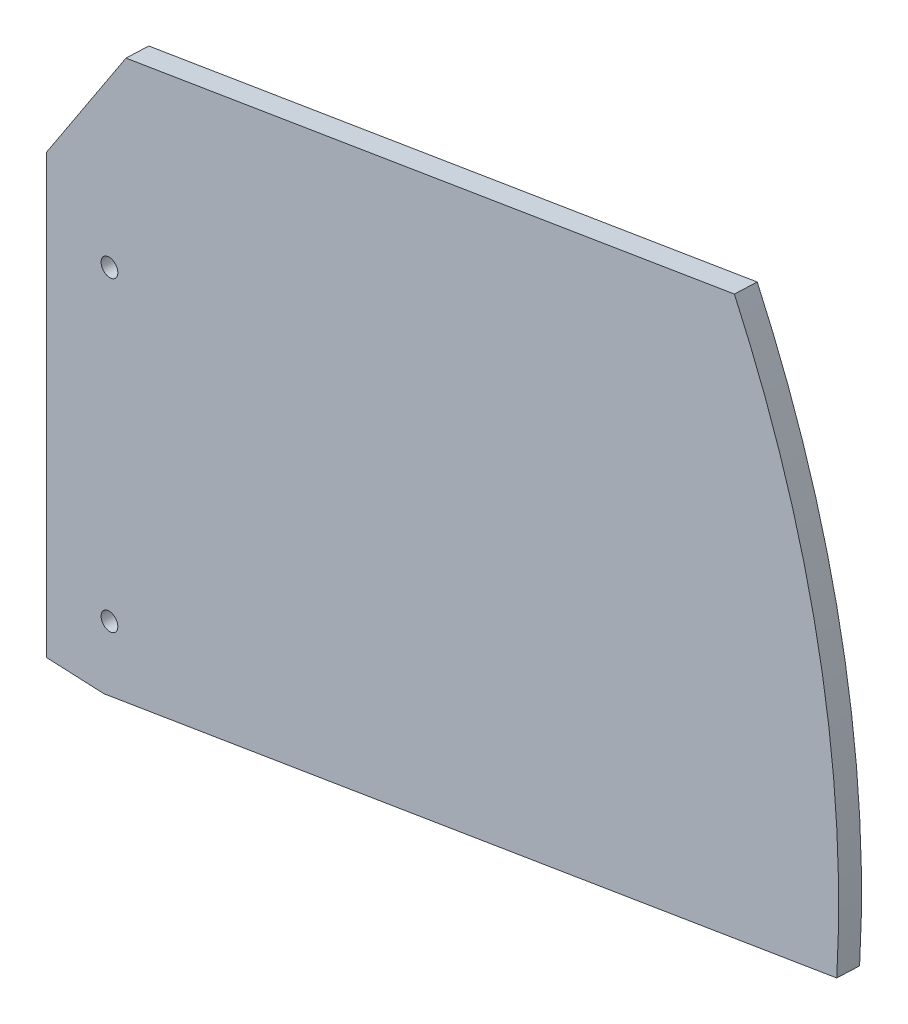
ISO-10303-21;
HEADER;
FILE_DESCRIPTION(('STEP AP214'),'2;1');
FILE_NAME('part.step','',(''),(''),'','','');
FILE_SCHEMA(('AUTOMOTIVE_DESIGN { 1 0 10303 214 1 1 1 1 }'));
ENDSEC;
DATA;
#1=APPLICATION_CONTEXT('core data for automotive mechanical design processes');
#2=APPLICATION_PROTOCOL_DEFINITION('international standard','automotive_design',2000,#1);
#3=PRODUCT_CONTEXT('',#1,'mechanical');
#4=PRODUCT('Part','Part','',(#3));
#5=PRODUCT_RELATED_PRODUCT_CATEGORY('part','',(#4));
#6=PRODUCT_DEFINITION_FORMATION('','',#4);
#7=PRODUCT_DEFINITION_CONTEXT('part definition',#1,'design');
#8=PRODUCT_DEFINITION('design','',#6,#7);
#9=PRODUCT_DEFINITION_SHAPE('','',#8);
#10=(LENGTH_UNIT() NAMED_UNIT(*) SI_UNIT(.MILLI.,.METRE.));
#11=(NAMED_UNIT(*) PLANE_ANGLE_UNIT() SI_UNIT($,.RADIAN.));
#12=(NAMED_UNIT(*) SI_UNIT($,.STERADIAN.) SOLID_ANGLE_UNIT());
#13=UNCERTAINTY_MEASURE_WITH_UNIT(LENGTH_MEASURE(1.E-05),#10,'distance_accuracy_value','');
#14=(GEOMETRIC_REPRESENTATION_CONTEXT(3) GLOBAL_UNCERTAINTY_ASSIGNED_CONTEXT((#13)) GLOBAL_UNIT_ASSIGNED_CONTEXT((#10,
#11,#12)) REPRESENTATION_CONTEXT('',''));
#15=CARTESIAN_POINT('',(0.,0.,0.));
#16=DIRECTION('',(0.,0.,1.));
#17=DIRECTION('',(1.,0.,0.));
#18=AXIS2_PLACEMENT_3D('',#15,#16,#17);
#19=CARTESIAN_POINT('',(29.3919854516671,-17.5,128.608300989372));
#20=DIRECTION('',(0.0436193873653366,0.,-0.999048221581858));
#21=DIRECTION('',(-0.999048221581858,0.,-0.0436193873653366));
#22=AXIS2_PLACEMENT_3D('',#19,#20,#21);
#23=CYLINDRICAL_SURFACE('',#22,1.00000013504685);
#24=CARTESIAN_POINT('',(34.7638598781959,-17.5,5.57214856854477));
#25=DIRECTION('',(0.0436193873653366,0.,-0.999048221581858));
#26=DIRECTION('',(-0.999048221581858,0.,-0.0436193873653366));
#27=AXIS2_PLACEMENT_3D('',#24,#25,#26);
#28=CIRCLE('',#27,1.00000013504685);
#29=CARTESIAN_POINT('',(33.7648115216957,-17.5,5.52852917528877));
#30=VERTEX_POINT('',#29);
#31=EDGE_CURVE('E55',#30,#30,#28,.T.);
#32=ORIENTED_EDGE('',*,*,#31,.F.);
#33=EDGE_LOOP('',(#32));
#34=FACE_BOUND('',#33,.T.);
#35=CARTESIAN_POINT('',(34.8729083466093,-17.5,3.0745280145901));
#36=DIRECTION('',(0.0436193873653365,0.,-0.999048221581858));
#37=DIRECTION('',(-0.999048221581858,0.,-0.0436193873653365));
#38=AXIS2_PLACEMENT_3D('',#35,#36,#37);
#39=CIRCLE('',#38,1.00000013504685);
#40=CARTESIAN_POINT('',(33.8738599901091,-17.5,3.0309086213341));
#41=VERTEX_POINT('',#40);
#42=EDGE_CURVE('E128',#41,#41,#39,.F.);
#43=ORIENTED_EDGE('',*,*,#42,.F.);
#44=EDGE_LOOP('',(#43));
#45=FACE_BOUND('',#44,.T.);
#46=ADVANCED_FACE('F45',(#34,#45),#23,.F.);
#47=CARTESIAN_POINT('',(29.3919854516671,17.5,128.608300989372));
#48=DIRECTION('',(0.0436193873653366,0.,-0.999048221581858));
#49=DIRECTION('',(-0.999048221581858,0.,-0.0436193873653366));
#50=AXIS2_PLACEMENT_3D('',#47,#48,#49);
#51=CYLINDRICAL_SURFACE('',#50,1.00000013504685);
#52=CARTESIAN_POINT('',(34.7638598781959,17.5,5.57214856854477));
#53=DIRECTION('',(0.0436193873653366,0.,-0.999048221581858));
#54=DIRECTION('',(-0.999048221581858,0.,-0.0436193873653366));
#55=AXIS2_PLACEMENT_3D('',#52,#53,#54);
#56=CIRCLE('',#55,1.00000013504685);
#57=CARTESIAN_POINT('',(33.7648115216957,17.5,5.52852917528877));
#58=VERTEX_POINT('',#57);
#59=EDGE_CURVE('E11',#58,#58,#56,.T.);
#60=ORIENTED_EDGE('',*,*,#59,.F.);
#61=EDGE_LOOP('',(#60));
#62=FACE_BOUND('',#61,.T.);
#63=CARTESIAN_POINT('',(34.8729083466093,17.5,3.0745280145901));
#64=DIRECTION('',(0.0436193873653365,0.,-0.999048221581858));
#65=DIRECTION('',(-0.999048221581858,0.,-0.0436193873653365));
#66=AXIS2_PLACEMENT_3D('',#63,#64,#65);
#67=CIRCLE('',#66,1.00000013504685);
#68=CARTESIAN_POINT('',(33.8738599901091,17.5,3.0309086213341));
#69=VERTEX_POINT('',#68);
#70=EDGE_CURVE('E115',#69,#69,#67,.F.);
#71=ORIENTED_EDGE('',*,*,#70,.F.);
#72=EDGE_LOOP('',(#71));
#73=FACE_BOUND('',#72,.T.);
#74=ADVANCED_FACE('F47',(#62,#73),#51,.F.);
#75=CARTESIAN_POINT('',(-5.54855330895833,-25.,127.082764121352));
#76=DIRECTION('',(0.,1.,0.));
#77=DIRECTION('',(0.,0.,1.));
#78=AXIS2_PLACEMENT_3D('',#75,#76,#77);
#79=PLANE('',#78);
#80=DIRECTION('',(0.0436193873653366,0.,-0.999048221581858));
#81=VECTOR('',#80,1.);
#82=CARTESIAN_POINT('',(28.7414972189742,-25.,128.579900059782));
#83=LINE('',#82,#81);
#84=CARTESIAN_POINT('',(34.113371645503,-25.,5.54374763895452));
#85=VERTEX_POINT('',#84);
#86=CARTESIAN_POINT('',(34.2224201139163,-25.,3.04612708499982));
#87=VERTEX_POINT('',#86);
#88=EDGE_CURVE('E119',#85,#87,#83,.T.);
#89=ORIENTED_EDGE('',*,*,#88,.F.);
#90=DIRECTION('',(-0.999048221581858,0.,-0.0436193873653366));
#91=VECTOR('',#90,1.);
#92=CARTESIAN_POINT('',(-0.176678882429508,-25.,4.04661170052444));
#93=LINE('',#92,#91);
#94=CARTESIAN_POINT('',(27.270998216332,-25.,5.24500316330476));
#95=VERTEX_POINT('',#94);
#96=EDGE_CURVE('E49',#85,#95,#93,.T.);
#97=ORIENTED_EDGE('',*,*,#96,.T.);
#98=DIRECTION('',(0.0436193873653366,0.,-0.999048221581858));
#99=VECTOR('',#98,1.);
#100=CARTESIAN_POINT('',(21.8991237898032,-25.,128.281155584132));
#101=LINE('',#100,#99);
#102=CARTESIAN_POINT('',(27.3800466847453,-25.,2.74738260935008));
#103=VERTEX_POINT('',#102);
#104=EDGE_CURVE('E196',#95,#103,#101,.T.);
#105=ORIENTED_EDGE('',*,*,#104,.T.);
#106=DIRECTION('',(0.999048221581858,0.,0.0436193873653365));
#107=VECTOR('',#106,1.);
#108=CARTESIAN_POINT('',(-0.0676304140161659,-25.,1.54899114656976));
#109=LINE('',#108,#107);
#110=EDGE_CURVE('E120',#103,#87,#109,.T.);
#111=ORIENTED_EDGE('',*,*,#110,.T.);
#112=EDGE_LOOP('',(#89,#97,#105,#111));
#113=FACE_BOUND('',#112,.T.);
#114=ADVANCED_FACE('F159',(#113),#79,.F.);
#115=CARTESIAN_POINT('',(21.8991237898032,0.,128.281155584132));
#116=DIRECTION('',(0.999048221581858,0.,0.0436193873653366));
#117=DIRECTION('',(0.0436193873653366,0.,-0.999048221581858));
#118=AXIS2_PLACEMENT_3D('',#115,#116,#117);
#119=PLANE('',#118);
#120=ORIENTED_EDGE('',*,*,#104,.F.);
#121=DIRECTION('',(0.,1.,0.));
#122=VECTOR('',#121,1.);
#123=CARTESIAN_POINT('',(27.270998216332,0.,5.24500316330474));
#124=LINE('',#123,#122);
#125=CARTESIAN_POINT('',(27.270998216332,25.,5.24500316330474));
#126=VERTEX_POINT('',#125);
#127=EDGE_CURVE('E131',#95,#126,#124,.T.);
#128=ORIENTED_EDGE('',*,*,#127,.T.);
#129=DIRECTION('',(0.0436193873653366,0.,-0.999048221581858));
#130=VECTOR('',#129,1.);
#131=CARTESIAN_POINT('',(21.8991237898032,25.,128.281155584132));
#132=LINE('',#131,#130);
#133=CARTESIAN_POINT('',(27.3800466847453,25.,2.74738260935008));
#134=VERTEX_POINT('',#133);
#135=EDGE_CURVE('E191',#126,#134,#132,.T.);
#136=ORIENTED_EDGE('',*,*,#135,.T.);
#137=DIRECTION('',(0.,-1.,0.));
#138=VECTOR('',#137,1.);
#139=CARTESIAN_POINT('',(27.3800466847453,0.,2.74738260935008));
#140=LINE('',#139,#138);
#141=EDGE_CURVE('E122',#134,#103,#140,.T.);
#142=ORIENTED_EDGE('',*,*,#141,.T.);
#143=EDGE_LOOP('',(#120,#128,#136,#142));
#144=FACE_BOUND('',#143,.T.);
#145=ADVANCED_FACE('F175',(#144),#119,.F.);
#146=CARTESIAN_POINT('',(1.93936242115658,-4.99262466653474,127.409693582548));
#147=DIRECTION('',(-0.831466947064897,0.554386900032706,-0.0363026309061158));
#148=DIRECTION('',(-0.554752569488118,-0.832015376448255,0.));
#149=AXIS2_PLACEMENT_3D('',#146,#147,#148);
#150=PLANE('',#149);
#151=DIRECTION('',(-0.553859246545954,-0.832259073289157,-0.0241820169427947));
#152=VECTOR('',#151,1.);
#153=CARTESIAN_POINT('',(7.31123684768539,-4.99262466653474,4.37354116172074));
#154=LINE('',#153,#152);
#155=CARTESIAN_POINT('',(36.7399653153755,39.2285857499025,5.65842719521868));
#156=VERTEX_POINT('',#155);
#157=EDGE_CURVE('E134',#156,#126,#154,.T.);
#158=ORIENTED_EDGE('',*,*,#157,.F.);
#159=DIRECTION('',(0.0436193873653366,0.,-0.999048221581858));
#160=VECTOR('',#159,1.);
#161=CARTESIAN_POINT('',(31.3680908888467,39.2285857499025,128.694579616046));
#162=LINE('',#161,#160);
#163=CARTESIAN_POINT('',(36.8490137837889,39.2285857499025,3.16080664126402));
#164=VERTEX_POINT('',#163);
#165=EDGE_CURVE('E190',#156,#164,#162,.T.);
#166=ORIENTED_EDGE('',*,*,#165,.T.);
#167=DIRECTION('',(0.553859246545954,0.832259073289157,0.0241820169427947));
#168=VECTOR('',#167,1.);
#169=CARTESIAN_POINT('',(7.42028531609874,-4.99262466653473,1.87592060776606));
#170=LINE('',#169,#168);
#171=EDGE_CURVE('E201',#134,#164,#170,.T.);
#172=ORIENTED_EDGE('',*,*,#171,.F.);
#173=ORIENTED_EDGE('',*,*,#135,.F.);
#174=EDGE_LOOP('',(#158,#166,#172,#173));
#175=FACE_BOUND('',#174,.T.);
#176=ADVANCED_FACE('F178',(#175),#150,.T.);
#177=CARTESIAN_POINT('',(-11.6737284184888,30.5951505871221,126.81533320059));
#178=DIRECTION('',(-0.196298287546547,0.98050677084091,-0.0085705683256086));
#179=DIRECTION('',(-0.980542784211567,-0.196305497453913,0.));
#180=AXIS2_PLACEMENT_3D('',#177,#178,#179);
#181=PLANE('',#180);
#182=DIRECTION('',(-0.979573545657581,-0.196485298012678,-0.042769104651645));
#183=VECTOR('',#182,1.);
#184=CARTESIAN_POINT('',(-6.30185399195996,30.5951505871221,3.77918077976257));
#185=LINE('',#184,#183);
#186=CARTESIAN_POINT('',(109.374319684513,53.7977651927773,8.82971159452624));
#187=VERTEX_POINT('',#186);
#188=EDGE_CURVE('E136',#187,#156,#185,.T.);
#189=ORIENTED_EDGE('',*,*,#188,.F.);
#190=DIRECTION('',(0.0436193873653366,0.,-0.999048221581858));
#191=VECTOR('',#190,1.);
#192=CARTESIAN_POINT('',(104.002445257984,53.7977651927773,131.865864015354));
#193=LINE('',#192,#191);
#194=CARTESIAN_POINT('',(109.483368152926,53.7977651927773,6.33209104057156));
#195=VERTEX_POINT('',#194);
#196=EDGE_CURVE('E103',#187,#195,#193,.T.);
#197=ORIENTED_EDGE('',*,*,#196,.T.);
#198=DIRECTION('',(0.979573545657581,0.196485298012678,0.0427691046516449));
#199=VECTOR('',#198,1.);
#200=CARTESIAN_POINT('',(-6.19280552354661,30.5951505871221,1.28156022580793));
#201=LINE('',#200,#199);
#202=EDGE_CURVE('E114',#164,#195,#201,.T.);
#203=ORIENTED_EDGE('',*,*,#202,.F.);
#204=ORIENTED_EDGE('',*,*,#165,.F.);
#205=EDGE_LOOP('',(#189,#197,#203,#204));
#206=FACE_BOUND('',#205,.T.);
#207=ADVANCED_FACE('F150',(#206),#181,.T.);
#208=CARTESIAN_POINT('',(-5.54855330895833,0.,127.082764121352));
#209=DIRECTION('',(-0.0436193873653366,0.,0.999048221581858));
#210=DIRECTION('',(0.,1.,0.));
#211=AXIS2_PLACEMENT_3D('',#208,#209,#210);
#212=ELLIPSE('',#211,122.235103500815,122.118762767364);
#213=DIRECTION('',(0.0436193873653366,0.,-0.999048221581858));
#214=VECTOR('',#213,1.);
#215=SURFACE_OF_LINEAR_EXTRUSION('',#212,#214);
#216=ORIENTED_EDGE('',*,*,#196,.F.);
#217=CARTESIAN_POINT('',(-0.176678882429518,0.,4.04661170052448));
#218=DIRECTION('',(-0.0436193873653366,0.,0.999048221581858));
#219=DIRECTION('',(0.,1.,0.));
#220=AXIS2_PLACEMENT_3D('',#217,#218,#219);
#221=ELLIPSE('',#220,122.235103500815,122.118762767364);
#222=CARTESIAN_POINT('',(121.598925621703,-7.45193000462398,9.36344941642904));
#223=VERTEX_POINT('',#222);
#224=EDGE_CURVE('E63',#187,#223,#221,.F.);
#225=ORIENTED_EDGE('',*,*,#224,.T.);
#226=DIRECTION('',(0.0436193873653366,0.,-0.999048221581858));
#227=VECTOR('',#226,1.);
#228=CARTESIAN_POINT('',(116.227051195174,-7.45193000462398,132.399601837257));
#229=LINE('',#228,#227);
#230=CARTESIAN_POINT('',(121.707974090116,-7.45193000462398,6.86582886247429));
#231=VERTEX_POINT('',#230);
#232=EDGE_CURVE('E96',#223,#231,#229,.T.);
#233=ORIENTED_EDGE('',*,*,#232,.T.);
#234=CARTESIAN_POINT('',(-0.0676304140161737,0.,1.54899114656976));
#235=DIRECTION('',(-0.0436193873653366,0.,0.999048221581858));
#236=DIRECTION('',(0.,1.,0.));
#237=AXIS2_PLACEMENT_3D('',#234,#235,#236);
#238=ELLIPSE('',#237,122.235103500815,122.118762767364);
#239=EDGE_CURVE('E99',#231,#195,#238,.T.);
#240=ORIENTED_EDGE('',*,*,#239,.T.);
#241=EDGE_LOOP('',(#216,#225,#233,#240));
#242=FACE_BOUND('',#241,.T.);
#243=ADVANCED_FACE('F98',(#242),#215,.F.);
#244=CARTESIAN_POINT('',(0.587059579215182,-30.6472871225956,127.350650765371));
#245=DIRECTION('',(-0.196298287546547,0.98050677084091,-0.0085705683256086));
#246=DIRECTION('',(-0.980542784211567,-0.196305497453913,0.));
#247=AXIS2_PLACEMENT_3D('',#244,#245,#246);
#248=PLANE('',#247);
#249=ORIENTED_EDGE('',*,*,#232,.F.);
#250=DIRECTION('',(-0.979573545657581,-0.196485298012678,-0.042769104651645));
#251=VECTOR('',#250,1.);
#252=CARTESIAN_POINT('',(5.958934005744,-30.6472871225956,4.3144983445437));
#253=LINE('',#252,#251);
#254=EDGE_CURVE('E139',#223,#85,#253,.T.);
#255=ORIENTED_EDGE('',*,*,#254,.T.);
#256=ORIENTED_EDGE('',*,*,#88,.T.);
#257=DIRECTION('',(0.979573545657581,0.196485298012678,0.0427691046516449));
#258=VECTOR('',#257,1.);
#259=CARTESIAN_POINT('',(6.06798247415735,-30.6472871225956,1.81687779058905));
#260=LINE('',#259,#258);
#261=EDGE_CURVE('E110',#87,#231,#260,.T.);
#262=ORIENTED_EDGE('',*,*,#261,.T.);
#263=EDGE_LOOP('',(#249,#255,#256,#262));
#264=FACE_BOUND('',#263,.T.);
#265=ADVANCED_FACE('F117',(#264),#248,.F.);
#266=CARTESIAN_POINT('',(-0.176678882429516,-27.5,4.04661170052443));
#267=DIRECTION('',(0.0436193873653366,0.,-0.999048221581858));
#268=DIRECTION('',(-0.999048221581858,0.,-0.0436193873653366));
#269=AXIS2_PLACEMENT_3D('',#266,#267,#268);
#270=PLANE('',#269);
#271=ORIENTED_EDGE('',*,*,#31,.T.);
#272=EDGE_LOOP('',(#271));
#273=FACE_BOUND('',#272,.T.);
#274=ORIENTED_EDGE('',*,*,#59,.T.);
#275=EDGE_LOOP('',(#274));
#276=FACE_BOUND('',#275,.T.);
#277=ORIENTED_EDGE('',*,*,#224,.F.);
#278=ORIENTED_EDGE('',*,*,#188,.T.);
#279=ORIENTED_EDGE('',*,*,#157,.T.);
#280=ORIENTED_EDGE('',*,*,#127,.F.);
#281=ORIENTED_EDGE('',*,*,#96,.F.);
#282=ORIENTED_EDGE('',*,*,#254,.F.);
#283=EDGE_LOOP('',(#277,#278,#279,#280,#281,#282));
#284=FACE_BOUND('',#283,.T.);
#285=ADVANCED_FACE('F153',(#273,#276,#284),#270,.F.);
#286=CARTESIAN_POINT('',(-0.067630414016175,-27.5,1.54899114656979));
#287=DIRECTION('',(0.0436193873653365,0.,-0.999048221581858));
#288=DIRECTION('',(-0.999048221581858,0.,-0.0436193873653365));
#289=AXIS2_PLACEMENT_3D('',#286,#287,#288);
#290=PLANE('',#289);
#291=ORIENTED_EDGE('',*,*,#70,.T.);
#292=EDGE_LOOP('',(#291));
#293=FACE_BOUND('',#292,.T.);
#294=ORIENTED_EDGE('',*,*,#261,.F.);
#295=ORIENTED_EDGE('',*,*,#110,.F.);
#296=ORIENTED_EDGE('',*,*,#141,.F.);
#297=ORIENTED_EDGE('',*,*,#171,.T.);
#298=ORIENTED_EDGE('',*,*,#202,.T.);
#299=ORIENTED_EDGE('',*,*,#239,.F.);
#300=EDGE_LOOP('',(#294,#295,#296,#297,#298,#299));
#301=FACE_BOUND('',#300,.T.);
#302=ORIENTED_EDGE('',*,*,#42,.T.);
#303=EDGE_LOOP('',(#302));
#304=FACE_BOUND('',#303,.T.);
#305=ADVANCED_FACE('F107',(#293,#301,#304),#290,.T.);
#306=CLOSED_SHELL('',(#46,#74,#114,#145,#176,#207,#243,#265,#285,#305));
#307=MANIFOLD_SOLID_BREP('B2',#306);
#308=ADVANCED_BREP_SHAPE_REPRESENTATION('',(#18,#307),#14);
#309=SHAPE_DEFINITION_REPRESENTATION(#9,#308);
ENDSEC;
END-ISO-10303-21;
